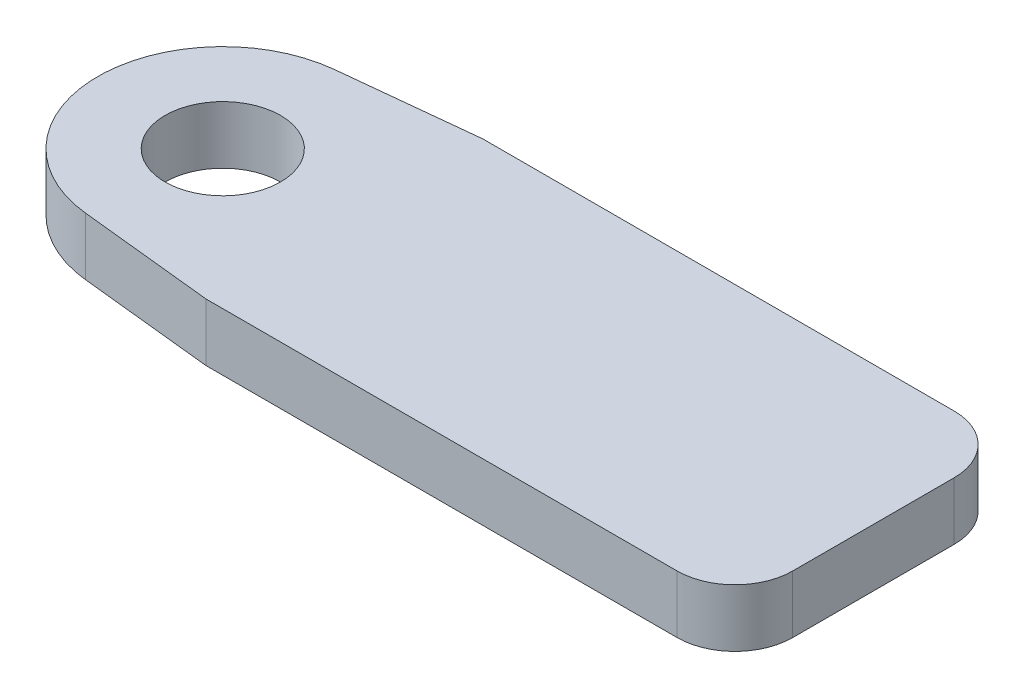
ISO-10303-21;
HEADER;
FILE_DESCRIPTION(('STEP AP214'),'2;1');
FILE_NAME('part.step','',(''),(''),'','','');
FILE_SCHEMA(('AUTOMOTIVE_DESIGN { 1 0 10303 214 1 1 1 1 }'));
ENDSEC;
DATA;
#1=APPLICATION_CONTEXT('core data for automotive mechanical design processes');
#2=APPLICATION_PROTOCOL_DEFINITION('international standard','automotive_design',2000,#1);
#3=PRODUCT_CONTEXT('',#1,'mechanical');
#4=PRODUCT('Part','Part','',(#3));
#5=PRODUCT_RELATED_PRODUCT_CATEGORY('part','',(#4));
#6=PRODUCT_DEFINITION_FORMATION('','',#4);
#7=PRODUCT_DEFINITION_CONTEXT('part definition',#1,'design');
#8=PRODUCT_DEFINITION('design','',#6,#7);
#9=PRODUCT_DEFINITION_SHAPE('','',#8);
#10=(LENGTH_UNIT() NAMED_UNIT(*) SI_UNIT(.MILLI.,.METRE.));
#11=(NAMED_UNIT(*) PLANE_ANGLE_UNIT() SI_UNIT($,.RADIAN.));
#12=(NAMED_UNIT(*) SI_UNIT($,.STERADIAN.) SOLID_ANGLE_UNIT());
#13=UNCERTAINTY_MEASURE_WITH_UNIT(LENGTH_MEASURE(1.E-05),#10,'distance_accuracy_value','');
#14=(GEOMETRIC_REPRESENTATION_CONTEXT(3) GLOBAL_UNCERTAINTY_ASSIGNED_CONTEXT((#13)) GLOBAL_UNIT_ASSIGNED_CONTEXT((#10,
#11,#12)) REPRESENTATION_CONTEXT('',''));
#15=CARTESIAN_POINT('',(0.,0.,0.));
#16=DIRECTION('',(0.,0.,1.));
#17=DIRECTION('',(1.,0.,0.));
#18=AXIS2_PLACEMENT_3D('',#15,#16,#17);
#19=CARTESIAN_POINT('',(0.,0.381,0.));
#20=DIRECTION('',(0.,1.,0.));
#21=DIRECTION('',(0.,0.,1.));
#22=AXIS2_PLACEMENT_3D('',#19,#20,#21);
#23=PLANE('',#22);
#24=CARTESIAN_POINT('',(0.,0.381,0.));
#25=DIRECTION('',(0.,1.,0.));
#26=DIRECTION('',(0.,0.,1.));
#27=AXIS2_PLACEMENT_3D('',#24,#25,#26);
#28=CIRCLE('',#27,1.651);
#29=CARTESIAN_POINT('',(-0.172545191501994,0.381,-1.64195893885613));
#30=VERTEX_POINT('',#29);
#31=CARTESIAN_POINT('',(-0.172545191501994,0.381,1.64195893885613));
#32=VERTEX_POINT('',#31);
#33=EDGE_CURVE('E145',#30,#32,#28,.T.);
#34=ORIENTED_EDGE('',*,*,#33,.T.);
#35=DIRECTION('',(0.994523887859556,0.,0.104509504241063));
#36=VECTOR('',#35,1.);
#37=CARTESIAN_POINT('',(-0.172545191501994,0.381,1.64195893885613));
#38=LINE('',#37,#36);
#39=CARTESIAN_POINT('',(1.60545480849801,0.381,1.8288));
#40=VERTEX_POINT('',#39);
#41=EDGE_CURVE('E93',#32,#40,#38,.T.);
#42=ORIENTED_EDGE('',*,*,#41,.T.);
#43=DIRECTION('',(1.,0.,0.));
#44=VECTOR('',#43,1.);
#45=CARTESIAN_POINT('',(7.828454808498,0.381,1.8288));
#46=LINE('',#45,#44);
#47=CARTESIAN_POINT('',(7.828454808498,0.381,1.8288));
#48=VERTEX_POINT('',#47);
#49=EDGE_CURVE('E160',#40,#48,#46,.T.);
#50=ORIENTED_EDGE('',*,*,#49,.T.);
#51=CARTESIAN_POINT('',(7.82845480849801,0.381,1.0668));
#52=DIRECTION('',(0.,1.,0.));
#53=DIRECTION('',(0.,0.,-1.));
#54=AXIS2_PLACEMENT_3D('',#51,#52,#53);
#55=CIRCLE('',#54,0.762);
#56=CARTESIAN_POINT('',(8.59045480849801,0.381,1.06679999999999));
#57=VERTEX_POINT('',#56);
#58=EDGE_CURVE('E173',#48,#57,#55,.T.);
#59=ORIENTED_EDGE('',*,*,#58,.T.);
#60=DIRECTION('',(0.,0.,-1.));
#61=VECTOR('',#60,1.);
#62=CARTESIAN_POINT('',(8.59045480849801,0.381,-1.06679999999999));
#63=LINE('',#62,#61);
#64=CARTESIAN_POINT('',(8.59045480849801,0.381,-1.06679999999999));
#65=VERTEX_POINT('',#64);
#66=EDGE_CURVE('E112',#57,#65,#63,.T.);
#67=ORIENTED_EDGE('',*,*,#66,.T.);
#68=CARTESIAN_POINT('',(7.82845480849801,0.381,-1.0668));
#69=DIRECTION('',(0.,1.,0.));
#70=DIRECTION('',(0.,0.,-1.));
#71=AXIS2_PLACEMENT_3D('',#68,#69,#70);
#72=CIRCLE('',#71,0.762);
#73=CARTESIAN_POINT('',(7.828454808498,0.381,-1.8288));
#74=VERTEX_POINT('',#73);
#75=EDGE_CURVE('E106',#65,#74,#72,.T.);
#76=ORIENTED_EDGE('',*,*,#75,.T.);
#77=DIRECTION('',(-1.,0.,0.));
#78=VECTOR('',#77,1.);
#79=CARTESIAN_POINT('',(1.60545480849801,0.381,-1.8288));
#80=LINE('',#79,#78);
#81=CARTESIAN_POINT('',(1.60545480849801,0.381,-1.8288));
#82=VERTEX_POINT('',#81);
#83=EDGE_CURVE('E110',#74,#82,#80,.T.);
#84=ORIENTED_EDGE('',*,*,#83,.T.);
#85=DIRECTION('',(-0.994523887859556,0.,0.104509504241063));
#86=VECTOR('',#85,1.);
#87=CARTESIAN_POINT('',(-0.172545191501994,0.381,-1.64195893885613));
#88=LINE('',#87,#86);
#89=EDGE_CURVE('E50',#82,#30,#88,.T.);
#90=ORIENTED_EDGE('',*,*,#89,.T.);
#91=EDGE_LOOP('',(#34,#42,#50,#59,#67,#76,#84,#90));
#92=FACE_BOUND('',#91,.T.);
#93=CARTESIAN_POINT('',(0.,0.381,0.));
#94=DIRECTION('',(0.,1.,0.));
#95=DIRECTION('',(0.,0.,1.));
#96=AXIS2_PLACEMENT_3D('',#93,#94,#95);
#97=CIRCLE('',#96,0.762);
#98=CARTESIAN_POINT('',(0.,0.381,-0.762));
#99=VERTEX_POINT('',#98);
#100=EDGE_CURVE('E134',#99,#99,#97,.T.);
#101=ORIENTED_EDGE('',*,*,#100,.F.);
#102=EDGE_LOOP('',(#101));
#103=FACE_BOUND('',#102,.T.);
#104=ADVANCED_FACE('F33',(#92,#103),#23,.T.);
#105=CARTESIAN_POINT('',(0.,-0.381,0.));
#106=DIRECTION('',(0.,1.,0.));
#107=DIRECTION('',(0.,0.,1.));
#108=AXIS2_PLACEMENT_3D('',#105,#106,#107);
#109=PLANE('',#108);
#110=CARTESIAN_POINT('',(0.,-0.381,0.));
#111=DIRECTION('',(0.,1.,0.));
#112=DIRECTION('',(0.,0.,1.));
#113=AXIS2_PLACEMENT_3D('',#110,#111,#112);
#114=CIRCLE('',#113,1.651);
#115=CARTESIAN_POINT('',(-0.172545191501994,-0.381,-1.64195893885613));
#116=VERTEX_POINT('',#115);
#117=CARTESIAN_POINT('',(-0.172545191501994,-0.381,1.64195893885613));
#118=VERTEX_POINT('',#117);
#119=EDGE_CURVE('E130',#116,#118,#114,.T.);
#120=ORIENTED_EDGE('',*,*,#119,.F.);
#121=DIRECTION('',(-0.994523887859556,0.,0.104509504241063));
#122=VECTOR('',#121,1.);
#123=CARTESIAN_POINT('',(-0.172545191501994,-0.381,-1.64195893885613));
#124=LINE('',#123,#122);
#125=CARTESIAN_POINT('',(1.60545480849801,-0.381,-1.8288));
#126=VERTEX_POINT('',#125);
#127=EDGE_CURVE('E85',#126,#116,#124,.T.);
#128=ORIENTED_EDGE('',*,*,#127,.F.);
#129=DIRECTION('',(-1.,0.,0.));
#130=VECTOR('',#129,1.);
#131=CARTESIAN_POINT('',(1.60545480849801,-0.381,-1.8288));
#132=LINE('',#131,#130);
#133=CARTESIAN_POINT('',(7.828454808498,-0.381,-1.8288));
#134=VERTEX_POINT('',#133);
#135=EDGE_CURVE('E79',#134,#126,#132,.T.);
#136=ORIENTED_EDGE('',*,*,#135,.F.);
#137=CARTESIAN_POINT('',(7.82845480849801,-0.381,-1.0668));
#138=DIRECTION('',(0.,1.,0.));
#139=DIRECTION('',(0.,0.,-1.));
#140=AXIS2_PLACEMENT_3D('',#137,#138,#139);
#141=CIRCLE('',#140,0.762);
#142=CARTESIAN_POINT('',(8.59045480849801,-0.381,-1.06679999999999));
#143=VERTEX_POINT('',#142);
#144=EDGE_CURVE('E120',#143,#134,#141,.T.);
#145=ORIENTED_EDGE('',*,*,#144,.F.);
#146=DIRECTION('',(0.,0.,-1.));
#147=VECTOR('',#146,1.);
#148=CARTESIAN_POINT('',(8.59045480849801,-0.381,-1.06679999999999));
#149=LINE('',#148,#147);
#150=CARTESIAN_POINT('',(8.59045480849801,-0.381,1.06679999999999));
#151=VERTEX_POINT('',#150);
#152=EDGE_CURVE('E140',#151,#143,#149,.T.);
#153=ORIENTED_EDGE('',*,*,#152,.F.);
#154=CARTESIAN_POINT('',(7.82845480849801,-0.381,1.0668));
#155=DIRECTION('',(0.,1.,0.));
#156=DIRECTION('',(0.,0.,-1.));
#157=AXIS2_PLACEMENT_3D('',#154,#155,#156);
#158=CIRCLE('',#157,0.762);
#159=CARTESIAN_POINT('',(7.828454808498,-0.381,1.8288));
#160=VERTEX_POINT('',#159);
#161=EDGE_CURVE('E138',#160,#151,#158,.T.);
#162=ORIENTED_EDGE('',*,*,#161,.F.);
#163=DIRECTION('',(1.,0.,0.));
#164=VECTOR('',#163,1.);
#165=CARTESIAN_POINT('',(7.828454808498,-0.381,1.8288));
#166=LINE('',#165,#164);
#167=CARTESIAN_POINT('',(1.60545480849801,-0.381,1.8288));
#168=VERTEX_POINT('',#167);
#169=EDGE_CURVE('E136',#168,#160,#166,.T.);
#170=ORIENTED_EDGE('',*,*,#169,.F.);
#171=DIRECTION('',(0.994523887859556,0.,0.104509504241063));
#172=VECTOR('',#171,1.);
#173=CARTESIAN_POINT('',(-0.172545191501994,-0.381,1.64195893885613));
#174=LINE('',#173,#172);
#175=EDGE_CURVE('E133',#118,#168,#174,.T.);
#176=ORIENTED_EDGE('',*,*,#175,.F.);
#177=EDGE_LOOP('',(#120,#128,#136,#145,#153,#162,#170,#176));
#178=FACE_BOUND('',#177,.T.);
#179=CARTESIAN_POINT('',(0.,-0.381,0.));
#180=DIRECTION('',(0.,1.,0.));
#181=DIRECTION('',(0.,0.,1.));
#182=AXIS2_PLACEMENT_3D('',#179,#180,#181);
#183=CIRCLE('',#182,0.762);
#184=CARTESIAN_POINT('',(0.,-0.381,-0.762));
#185=VERTEX_POINT('',#184);
#186=EDGE_CURVE('E179',#185,#185,#183,.T.);
#187=ORIENTED_EDGE('',*,*,#186,.T.);
#188=EDGE_LOOP('',(#187));
#189=FACE_BOUND('',#188,.T.);
#190=ADVANCED_FACE('F164',(#178,#189),#109,.F.);
#191=CARTESIAN_POINT('',(0.,0.381,0.));
#192=DIRECTION('',(0.,-1.,0.));
#193=DIRECTION('',(0.,0.,-1.));
#194=AXIS2_PLACEMENT_3D('',#191,#192,#193);
#195=CYLINDRICAL_SURFACE('',#194,1.651);
#196=ORIENTED_EDGE('',*,*,#119,.T.);
#197=DIRECTION('',(0.,-1.,0.));
#198=VECTOR('',#197,1.);
#199=CARTESIAN_POINT('',(-0.172545191501994,0.381,1.64195893885613));
#200=LINE('',#199,#198);
#201=EDGE_CURVE('E11',#32,#118,#200,.T.);
#202=ORIENTED_EDGE('',*,*,#201,.F.);
#203=ORIENTED_EDGE('',*,*,#33,.F.);
#204=DIRECTION('',(0.,-1.,0.));
#205=VECTOR('',#204,1.);
#206=CARTESIAN_POINT('',(-0.172545191501994,0.381,-1.64195893885613));
#207=LINE('',#206,#205);
#208=EDGE_CURVE('E126',#30,#116,#207,.T.);
#209=ORIENTED_EDGE('',*,*,#208,.T.);
#210=EDGE_LOOP('',(#196,#202,#203,#209));
#211=FACE_BOUND('',#210,.T.);
#212=ADVANCED_FACE('F35',(#211),#195,.T.);
#213=CARTESIAN_POINT('',(-0.172545191501994,0.381,1.64195893885613));
#214=DIRECTION('',(0.104509504241063,0.,-0.994523887859556));
#215=DIRECTION('',(-0.994523887859556,0.,-0.104509504241063));
#216=AXIS2_PLACEMENT_3D('',#213,#214,#215);
#217=PLANE('',#216);
#218=ORIENTED_EDGE('',*,*,#175,.T.);
#219=DIRECTION('',(0.,-1.,0.));
#220=VECTOR('',#219,1.);
#221=CARTESIAN_POINT('',(1.60545480849801,0.381,1.8288));
#222=LINE('',#221,#220);
#223=EDGE_CURVE('E42',#40,#168,#222,.T.);
#224=ORIENTED_EDGE('',*,*,#223,.F.);
#225=ORIENTED_EDGE('',*,*,#41,.F.);
#226=ORIENTED_EDGE('',*,*,#201,.T.);
#227=EDGE_LOOP('',(#218,#224,#225,#226));
#228=FACE_BOUND('',#227,.T.);
#229=ADVANCED_FACE('F207',(#228),#217,.F.);
#230=CARTESIAN_POINT('',(7.828454808498,0.381,1.8288));
#231=DIRECTION('',(0.,0.,-1.));
#232=DIRECTION('',(-1.,0.,0.));
#233=AXIS2_PLACEMENT_3D('',#230,#231,#232);
#234=PLANE('',#233);
#235=ORIENTED_EDGE('',*,*,#169,.T.);
#236=DIRECTION('',(0.,-1.,0.));
#237=VECTOR('',#236,1.);
#238=CARTESIAN_POINT('',(7.828454808498,0.381,1.8288));
#239=LINE('',#238,#237);
#240=EDGE_CURVE('E152',#48,#160,#239,.T.);
#241=ORIENTED_EDGE('',*,*,#240,.F.);
#242=ORIENTED_EDGE('',*,*,#49,.F.);
#243=ORIENTED_EDGE('',*,*,#223,.T.);
#244=EDGE_LOOP('',(#235,#241,#242,#243));
#245=FACE_BOUND('',#244,.T.);
#246=ADVANCED_FACE('F158',(#245),#234,.F.);
#247=CARTESIAN_POINT('',(7.82845480849801,0.381,1.0668));
#248=DIRECTION('',(0.,-1.,0.));
#249=DIRECTION('',(0.,0.,-1.));
#250=AXIS2_PLACEMENT_3D('',#247,#248,#249);
#251=CYLINDRICAL_SURFACE('',#250,0.762);
#252=ORIENTED_EDGE('',*,*,#161,.T.);
#253=DIRECTION('',(0.,-1.,0.));
#254=VECTOR('',#253,1.);
#255=CARTESIAN_POINT('',(8.59045480849801,0.381,1.06679999999999));
#256=LINE('',#255,#254);
#257=EDGE_CURVE('E149',#57,#151,#256,.T.);
#258=ORIENTED_EDGE('',*,*,#257,.F.);
#259=ORIENTED_EDGE('',*,*,#58,.F.);
#260=ORIENTED_EDGE('',*,*,#240,.T.);
#261=EDGE_LOOP('',(#252,#258,#259,#260));
#262=FACE_BOUND('',#261,.T.);
#263=ADVANCED_FACE('F169',(#262),#251,.T.);
#264=CARTESIAN_POINT('',(8.59045480849801,0.381,-1.06679999999999));
#265=DIRECTION('',(-1.,0.,0.));
#266=DIRECTION('',(0.,0.,1.));
#267=AXIS2_PLACEMENT_3D('',#264,#265,#266);
#268=PLANE('',#267);
#269=ORIENTED_EDGE('',*,*,#152,.T.);
#270=DIRECTION('',(0.,-1.,0.));
#271=VECTOR('',#270,1.);
#272=CARTESIAN_POINT('',(8.59045480849801,0.381,-1.06679999999999));
#273=LINE('',#272,#271);
#274=EDGE_CURVE('E121',#65,#143,#273,.T.);
#275=ORIENTED_EDGE('',*,*,#274,.F.);
#276=ORIENTED_EDGE('',*,*,#66,.F.);
#277=ORIENTED_EDGE('',*,*,#257,.T.);
#278=EDGE_LOOP('',(#269,#275,#276,#277));
#279=FACE_BOUND('',#278,.T.);
#280=ADVANCED_FACE('F172',(#279),#268,.F.);
#281=CARTESIAN_POINT('',(7.82845480849801,0.381,-1.0668));
#282=DIRECTION('',(0.,-1.,0.));
#283=DIRECTION('',(0.,0.,-1.));
#284=AXIS2_PLACEMENT_3D('',#281,#282,#283);
#285=CYLINDRICAL_SURFACE('',#284,0.762);
#286=ORIENTED_EDGE('',*,*,#144,.T.);
#287=DIRECTION('',(0.,-1.,0.));
#288=VECTOR('',#287,1.);
#289=CARTESIAN_POINT('',(7.828454808498,0.381,-1.8288));
#290=LINE('',#289,#288);
#291=EDGE_CURVE('E117',#74,#134,#290,.T.);
#292=ORIENTED_EDGE('',*,*,#291,.F.);
#293=ORIENTED_EDGE('',*,*,#75,.F.);
#294=ORIENTED_EDGE('',*,*,#274,.T.);
#295=EDGE_LOOP('',(#286,#292,#293,#294));
#296=FACE_BOUND('',#295,.T.);
#297=ADVANCED_FACE('F118',(#296),#285,.T.);
#298=CARTESIAN_POINT('',(1.60545480849801,0.381,-1.8288));
#299=DIRECTION('',(0.,0.,1.));
#300=DIRECTION('',(1.,0.,0.));
#301=AXIS2_PLACEMENT_3D('',#298,#299,#300);
#302=PLANE('',#301);
#303=ORIENTED_EDGE('',*,*,#135,.T.);
#304=DIRECTION('',(0.,-1.,0.));
#305=VECTOR('',#304,1.);
#306=CARTESIAN_POINT('',(1.60545480849801,0.381,-1.8288));
#307=LINE('',#306,#305);
#308=EDGE_CURVE('E122',#82,#126,#307,.T.);
#309=ORIENTED_EDGE('',*,*,#308,.F.);
#310=ORIENTED_EDGE('',*,*,#83,.F.);
#311=ORIENTED_EDGE('',*,*,#291,.T.);
#312=EDGE_LOOP('',(#303,#309,#310,#311));
#313=FACE_BOUND('',#312,.T.);
#314=ADVANCED_FACE('F124',(#313),#302,.F.);
#315=CARTESIAN_POINT('',(-0.172545191501994,0.381,-1.64195893885613));
#316=DIRECTION('',(0.104509504241063,0.,0.994523887859556));
#317=DIRECTION('',(0.994523887859556,0.,-0.104509504241063));
#318=AXIS2_PLACEMENT_3D('',#315,#316,#317);
#319=PLANE('',#318);
#320=ORIENTED_EDGE('',*,*,#127,.T.);
#321=ORIENTED_EDGE('',*,*,#208,.F.);
#322=ORIENTED_EDGE('',*,*,#89,.F.);
#323=ORIENTED_EDGE('',*,*,#308,.T.);
#324=EDGE_LOOP('',(#320,#321,#322,#323));
#325=FACE_BOUND('',#324,.T.);
#326=ADVANCED_FACE('F195',(#325),#319,.F.);
#327=CARTESIAN_POINT('',(0.,0.381,0.));
#328=DIRECTION('',(0.,-1.,0.));
#329=DIRECTION('',(0.,0.,-1.));
#330=AXIS2_PLACEMENT_3D('',#327,#328,#329);
#331=CYLINDRICAL_SURFACE('',#330,0.762);
#332=CARTESIAN_POINT('',(0.,0.381,-0.762));
#333=CARTESIAN_POINT('',(0.,0.3730625,-0.762));
#334=CARTESIAN_POINT('',(0.,0.365125,-0.762));
#335=CARTESIAN_POINT('',(0.,0.34925,-0.762));
#336=CARTESIAN_POINT('',(0.,0.3413125,-0.762));
#337=CARTESIAN_POINT('',(0.,0.3254375,-0.762));
#338=CARTESIAN_POINT('',(0.,0.3175,-0.762));
#339=CARTESIAN_POINT('',(0.,0.301625,-0.762));
#340=CARTESIAN_POINT('',(0.,0.2936875,-0.762));
#341=CARTESIAN_POINT('',(0.,0.2778125,-0.762));
#342=CARTESIAN_POINT('',(0.,0.269875,-0.762));
#343=CARTESIAN_POINT('',(0.,0.254,-0.762));
#344=CARTESIAN_POINT('',(0.,0.2460625,-0.762));
#345=CARTESIAN_POINT('',(0.,0.2301875,-0.762));
#346=CARTESIAN_POINT('',(0.,0.22225,-0.762));
#347=CARTESIAN_POINT('',(0.,0.206375,-0.762));
#348=CARTESIAN_POINT('',(0.,0.1984375,-0.762));
#349=CARTESIAN_POINT('',(0.,0.1825625,-0.762));
#350=CARTESIAN_POINT('',(0.,0.174625,-0.762));
#351=CARTESIAN_POINT('',(0.,0.15875,-0.762));
#352=CARTESIAN_POINT('',(0.,0.1508125,-0.762));
#353=CARTESIAN_POINT('',(0.,0.1349375,-0.762));
#354=CARTESIAN_POINT('',(0.,0.127,-0.762));
#355=CARTESIAN_POINT('',(0.,0.111125,-0.762));
#356=CARTESIAN_POINT('',(0.,0.1031875,-0.762));
#357=CARTESIAN_POINT('',(0.,0.0873125,-0.762));
#358=CARTESIAN_POINT('',(0.,0.0793749999999999,-0.762));
#359=CARTESIAN_POINT('',(0.,0.0635,-0.762));
#360=CARTESIAN_POINT('',(0.,0.0555625,-0.762));
#361=CARTESIAN_POINT('',(0.,0.0396875,-0.762));
#362=CARTESIAN_POINT('',(0.,0.03175,-0.762));
#363=CARTESIAN_POINT('',(0.,0.015875,-0.762));
#364=CARTESIAN_POINT('',(0.,0.00793749999999995,-0.762));
#365=CARTESIAN_POINT('',(0.,-0.00793750000000006,-0.762));
#366=CARTESIAN_POINT('',(0.,-0.0158750000000001,-0.762));
#367=CARTESIAN_POINT('',(0.,-0.0317500000000001,-0.762));
#368=CARTESIAN_POINT('',(0.,-0.0396875000000001,-0.762));
#369=CARTESIAN_POINT('',(0.,-0.0555625000000001,-0.762));
#370=CARTESIAN_POINT('',(0.,-0.0635000000000001,-0.762));
#371=CARTESIAN_POINT('',(0.,-0.0793750000000001,-0.762));
#372=CARTESIAN_POINT('',(0.,-0.0873125000000001,-0.762));
#373=CARTESIAN_POINT('',(0.,-0.1031875,-0.762));
#374=CARTESIAN_POINT('',(0.,-0.111125,-0.762));
#375=CARTESIAN_POINT('',(0.,-0.127,-0.762));
#376=CARTESIAN_POINT('',(0.,-0.1349375,-0.762));
#377=CARTESIAN_POINT('',(0.,-0.1508125,-0.762));
#378=CARTESIAN_POINT('',(0.,-0.15875,-0.762));
#379=CARTESIAN_POINT('',(0.,-0.174625,-0.762));
#380=CARTESIAN_POINT('',(0.,-0.1825625,-0.762));
#381=CARTESIAN_POINT('',(0.,-0.1984375,-0.762));
#382=CARTESIAN_POINT('',(0.,-0.206375,-0.762));
#383=CARTESIAN_POINT('',(0.,-0.22225,-0.762));
#384=CARTESIAN_POINT('',(0.,-0.2301875,-0.762));
#385=CARTESIAN_POINT('',(0.,-0.2460625,-0.762));
#386=CARTESIAN_POINT('',(0.,-0.254,-0.762));
#387=CARTESIAN_POINT('',(0.,-0.269875,-0.762));
#388=CARTESIAN_POINT('',(0.,-0.2778125,-0.762));
#389=CARTESIAN_POINT('',(0.,-0.2936875,-0.762));
#390=CARTESIAN_POINT('',(0.,-0.301625,-0.762));
#391=CARTESIAN_POINT('',(0.,-0.3175,-0.762));
#392=CARTESIAN_POINT('',(0.,-0.3254375,-0.762));
#393=CARTESIAN_POINT('',(0.,-0.3413125,-0.762));
#394=CARTESIAN_POINT('',(0.,-0.34925,-0.762));
#395=CARTESIAN_POINT('',(0.,-0.365125,-0.762));
#396=CARTESIAN_POINT('',(0.,-0.3730625,-0.762));
#397=CARTESIAN_POINT('',(0.,-0.381,-0.762));
#398=B_SPLINE_CURVE_WITH_KNOTS('',3,(#332,#333,#334,#335,#336,#337,#338,#339,#340,#341,#342,
#343,#344,#345,#346,#347,#348,#349,#350,#351,#352,#353,#354,#355,#356,#357,#358,#359,#360,#361,
#362,#363,#364,#365,#366,#367,#368,#369,#370,#371,#372,#373,#374,#375,#376,#377,#378,#379,#380,
#381,#382,#383,#384,#385,#386,#387,#388,#389,#390,#391,#392,#393,#394,#395,#396,#397),
.UNSPECIFIED.,.F.,.F.,(4,2,2,2,2,2,2,2,2,2,2,2,2,2,2,2,2,2,2,2,2,2,2,2,2,2,2,2,2,2,2,2,4),(0.,
0.0238125,0.047625,0.0714375,0.09525,0.1190625,0.142875,0.1666875,0.1905,0.2143125,0.238125,
0.2619375,0.28575,0.3095625,0.333375,0.3571875,0.381,0.4048125,0.428625,0.4524375,0.47625,
0.5000625,0.523875,0.5476875,0.5715,0.5953125,0.619125,0.6429375,0.66675,0.6905625,0.714375,
0.7381875,0.762),.UNSPECIFIED.);
#399=EDGE_CURVE('BSEAM185',#99,#185,#398,.T.);
#400=ORIENTED_EDGE('',*,*,#100,.T.);
#401=ORIENTED_EDGE('',*,*,#186,.F.);
#402=ORIENTED_EDGE('',*,*,#399,.T.);
#403=ORIENTED_EDGE('',*,*,#399,.F.);
#404=EDGE_LOOP('',(#400,#402,#401,#403));
#405=FACE_BOUND('',#404,.T.);
#406=ADVANCED_FACE('F185',(#405),#331,.F.);
#407=CLOSED_SHELL('',(#104,#190,#212,#229,#246,#263,#280,#297,#314,#326,#406));
#408=MANIFOLD_SOLID_BREP('B2',#407);
#409=ADVANCED_BREP_SHAPE_REPRESENTATION('',(#18,#408),#14);
#410=SHAPE_DEFINITION_REPRESENTATION(#9,#409);
ENDSEC;
END-ISO-10303-21;
